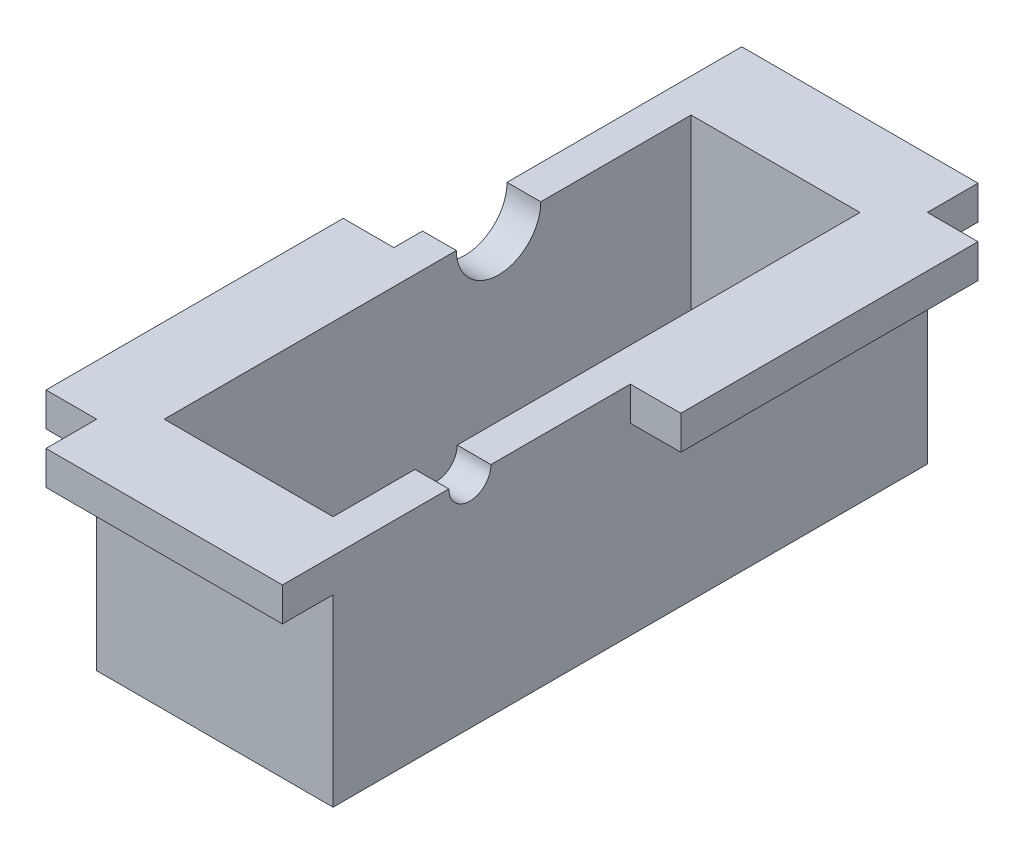
ISO-10303-21;
HEADER;
FILE_DESCRIPTION(('STEP AP214'),'2;1');
FILE_NAME('part.step','',(''),(''),'','','');
FILE_SCHEMA(('AUTOMOTIVE_DESIGN { 1 0 10303 214 1 1 1 1 }'));
ENDSEC;
DATA;
#1=APPLICATION_CONTEXT('core data for automotive mechanical design processes');
#2=APPLICATION_PROTOCOL_DEFINITION('international standard','automotive_design',2000,#1);
#3=PRODUCT_CONTEXT('',#1,'mechanical');
#4=PRODUCT('Part','Part','',(#3));
#5=PRODUCT_RELATED_PRODUCT_CATEGORY('part','',(#4));
#6=PRODUCT_DEFINITION_FORMATION('','',#4);
#7=PRODUCT_DEFINITION_CONTEXT('part definition',#1,'design');
#8=PRODUCT_DEFINITION('design','',#6,#7);
#9=PRODUCT_DEFINITION_SHAPE('','',#8);
#10=(LENGTH_UNIT() NAMED_UNIT(*) SI_UNIT(.MILLI.,.METRE.));
#11=(NAMED_UNIT(*) PLANE_ANGLE_UNIT() SI_UNIT($,.RADIAN.));
#12=(NAMED_UNIT(*) SI_UNIT($,.STERADIAN.) SOLID_ANGLE_UNIT());
#13=UNCERTAINTY_MEASURE_WITH_UNIT(LENGTH_MEASURE(1.E-05),#10,'distance_accuracy_value','');
#14=(GEOMETRIC_REPRESENTATION_CONTEXT(3) GLOBAL_UNCERTAINTY_ASSIGNED_CONTEXT((#13)) GLOBAL_UNIT_ASSIGNED_CONTEXT((#10,
#11,#12)) REPRESENTATION_CONTEXT('',''));
#15=CARTESIAN_POINT('',(0.,0.,0.));
#16=DIRECTION('',(0.,0.,1.));
#17=DIRECTION('',(1.,0.,0.));
#18=AXIS2_PLACEMENT_3D('',#15,#16,#17);
#19=CARTESIAN_POINT('',(-8.89,16.383,22.352));
#20=DIRECTION('',(0.,0.,-1.));
#21=DIRECTION('',(-1.,0.,0.));
#22=AXIS2_PLACEMENT_3D('',#19,#20,#21);
#23=PLANE('',#22);
#24=DIRECTION('',(0.,-1.,0.));
#25=VECTOR('',#24,1.);
#26=CARTESIAN_POINT('',(8.89,16.383,22.352));
#27=LINE('',#26,#25);
#28=CARTESIAN_POINT('',(8.89,13.843,22.352));
#29=VERTEX_POINT('',#28);
#30=CARTESIAN_POINT('',(8.89,0.,22.352));
#31=VERTEX_POINT('',#30);
#32=EDGE_CURVE('E358',#29,#31,#27,.T.);
#33=ORIENTED_EDGE('',*,*,#32,.F.);
#34=DIRECTION('',(-1.,0.,0.));
#35=VECTOR('',#34,1.);
#36=CARTESIAN_POINT('',(8.89,13.843,22.352));
#37=LINE('',#36,#35);
#38=CARTESIAN_POINT('',(-8.89,13.843,22.352));
#39=VERTEX_POINT('',#38);
#40=EDGE_CURVE('E230',#29,#39,#37,.T.);
#41=ORIENTED_EDGE('',*,*,#40,.T.);
#42=DIRECTION('',(0.,-1.,0.));
#43=VECTOR('',#42,1.);
#44=CARTESIAN_POINT('',(-8.89,16.383,22.352));
#45=LINE('',#44,#43);
#46=CARTESIAN_POINT('',(-8.89,0.,22.352));
#47=VERTEX_POINT('',#46);
#48=EDGE_CURVE('E375',#39,#47,#45,.T.);
#49=ORIENTED_EDGE('',*,*,#48,.T.);
#50=DIRECTION('',(1.,0.,0.));
#51=VECTOR('',#50,1.);
#52=CARTESIAN_POINT('',(-8.89,0.,22.352));
#53=LINE('',#52,#51);
#54=EDGE_CURVE('E366',#47,#31,#53,.T.);
#55=ORIENTED_EDGE('',*,*,#54,.T.);
#56=EDGE_LOOP('',(#33,#41,#49,#55));
#57=FACE_BOUND('',#56,.T.);
#58=ADVANCED_FACE('F39',(#57),#23,.F.);
#59=CARTESIAN_POINT('',(0.,16.383,0.));
#60=DIRECTION('',(0.,1.,0.));
#61=DIRECTION('',(0.,0.,1.));
#62=AXIS2_PLACEMENT_3D('',#59,#60,#61);
#63=PLANE('',#62);
#64=DIRECTION('',(1.,0.,0.));
#65=VECTOR('',#64,1.);
#66=CARTESIAN_POINT('',(4.572,16.383,13.6525));
#67=LINE('',#66,#65);
#68=CARTESIAN_POINT('',(6.35,16.383,13.6525));
#69=VERTEX_POINT('',#68);
#70=CARTESIAN_POINT('',(8.89,16.383,13.6525));
#71=VERTEX_POINT('',#70);
#72=EDGE_CURVE('E303',#69,#71,#67,.T.);
#73=ORIENTED_EDGE('',*,*,#72,.F.);
#74=DIRECTION('',(0.,0.,-1.));
#75=VECTOR('',#74,1.);
#76=CARTESIAN_POINT('',(6.35,16.383,-19.812));
#77=LINE('',#76,#75);
#78=CARTESIAN_POINT('',(6.35,16.383,19.812));
#79=VERTEX_POINT('',#78);
#80=EDGE_CURVE('E330',#79,#69,#77,.T.);
#81=ORIENTED_EDGE('',*,*,#80,.F.);
#82=DIRECTION('',(1.,0.,0.));
#83=VECTOR('',#82,1.);
#84=CARTESIAN_POINT('',(-6.35,16.383,19.812));
#85=LINE('',#84,#83);
#86=CARTESIAN_POINT('',(-6.35,16.383,19.812));
#87=VERTEX_POINT('',#86);
#88=EDGE_CURVE('E337',#87,#79,#85,.T.);
#89=ORIENTED_EDGE('',*,*,#88,.F.);
#90=DIRECTION('',(0.,0.,1.));
#91=VECTOR('',#90,1.);
#92=CARTESIAN_POINT('',(-6.35,16.383,-19.812));
#93=LINE('',#92,#91);
#94=CARTESIAN_POINT('',(-6.35,16.383,-2.15900000000001));
#95=VERTEX_POINT('',#94);
#96=EDGE_CURVE('E335',#95,#87,#93,.T.);
#97=ORIENTED_EDGE('',*,*,#96,.F.);
#98=DIRECTION('',(-1.,0.,0.));
#99=VECTOR('',#98,1.);
#100=CARTESIAN_POINT('',(-4.572,16.383,-2.15900000000001));
#101=LINE('',#100,#99);
#102=CARTESIAN_POINT('',(-8.89,16.383,-2.15900000000001));
#103=VERTEX_POINT('',#102);
#104=EDGE_CURVE('E308',#103,#95,#101,.F.);
#105=ORIENTED_EDGE('',*,*,#104,.F.);
#106=DIRECTION('',(0.,0.,1.));
#107=VECTOR('',#106,1.);
#108=CARTESIAN_POINT('',(-8.89,16.383,-22.352));
#109=LINE('',#108,#107);
#110=CARTESIAN_POINT('',(-8.89,16.383,0.));
#111=VERTEX_POINT('',#110);
#112=EDGE_CURVE('E353',#103,#111,#109,.T.);
#113=ORIENTED_EDGE('',*,*,#112,.T.);
#114=DIRECTION('',(-1.,0.,0.));
#115=VECTOR('',#114,1.);
#116=CARTESIAN_POINT('',(-8.89,16.383,0.));
#117=LINE('',#116,#115);
#118=CARTESIAN_POINT('',(-12.7,16.383,0.));
#119=VERTEX_POINT('',#118);
#120=EDGE_CURVE('E65',#111,#119,#117,.T.);
#121=ORIENTED_EDGE('',*,*,#120,.T.);
#122=DIRECTION('',(0.,0.,-1.));
#123=VECTOR('',#122,1.);
#124=CARTESIAN_POINT('',(-12.7,16.383,22.352));
#125=LINE('',#124,#123);
#126=CARTESIAN_POINT('',(-12.7,16.383,22.352));
#127=VERTEX_POINT('',#126);
#128=EDGE_CURVE('E243',#127,#119,#125,.T.);
#129=ORIENTED_EDGE('',*,*,#128,.F.);
#130=DIRECTION('',(1.,0.,0.));
#131=VECTOR('',#130,1.);
#132=CARTESIAN_POINT('',(-8.89,16.383,22.352));
#133=LINE('',#132,#131);
#134=CARTESIAN_POINT('',(-8.89,16.383,22.352));
#135=VERTEX_POINT('',#134);
#136=EDGE_CURVE('E360',#127,#135,#133,.T.);
#137=ORIENTED_EDGE('',*,*,#136,.T.);
#138=DIRECTION('',(0.,0.,1.));
#139=VECTOR('',#138,1.);
#140=CARTESIAN_POINT('',(-8.89,16.383,22.352));
#141=LINE('',#140,#139);
#142=CARTESIAN_POINT('',(-8.89,16.383,26.162));
#143=VERTEX_POINT('',#142);
#144=EDGE_CURVE('E53',#135,#143,#141,.T.);
#145=ORIENTED_EDGE('',*,*,#144,.T.);
#146=DIRECTION('',(-1.,0.,0.));
#147=VECTOR('',#146,1.);
#148=CARTESIAN_POINT('',(8.89,16.383,26.162));
#149=LINE('',#148,#147);
#150=CARTESIAN_POINT('',(8.89,16.383,26.162));
#151=VERTEX_POINT('',#150);
#152=EDGE_CURVE('E216',#151,#143,#149,.T.);
#153=ORIENTED_EDGE('',*,*,#152,.F.);
#154=DIRECTION('',(0.,0.,-1.));
#155=VECTOR('',#154,1.);
#156=CARTESIAN_POINT('',(8.89,16.383,-22.352));
#157=LINE('',#156,#155);
#158=EDGE_CURVE('E200',#151,#71,#157,.T.);
#159=ORIENTED_EDGE('',*,*,#158,.T.);
#160=EDGE_LOOP('',(#73,#81,#89,#97,#105,#113,#121,#129,#137,#145,#153,#159));
#161=FACE_BOUND('',#160,.T.);
#162=ADVANCED_FACE('F219',(#161),#63,.T.);
#163=CARTESIAN_POINT('',(8.89,16.383,-22.352));
#164=DIRECTION('',(-1.,0.,0.));
#165=DIRECTION('',(0.,0.,1.));
#166=AXIS2_PLACEMENT_3D('',#163,#164,#165);
#167=PLANE('',#166);
#168=DIRECTION('',(0.,0.,1.));
#169=VECTOR('',#168,1.);
#170=CARTESIAN_POINT('',(8.89,13.843,-22.352));
#171=LINE('',#170,#169);
#172=CARTESIAN_POINT('',(8.89,13.843,-22.352));
#173=VERTEX_POINT('',#172);
#174=CARTESIAN_POINT('',(8.89,13.843,0.));
#175=VERTEX_POINT('',#174);
#176=EDGE_CURVE('E50',#173,#175,#171,.T.);
#177=ORIENTED_EDGE('',*,*,#176,.T.);
#178=DIRECTION('',(0.,1.,0.));
#179=VECTOR('',#178,1.);
#180=CARTESIAN_POINT('',(8.89,16.383,0.));
#181=LINE('',#180,#179);
#182=CARTESIAN_POINT('',(8.89,16.383,0.));
#183=VERTEX_POINT('',#182);
#184=EDGE_CURVE('E11',#175,#183,#181,.T.);
#185=ORIENTED_EDGE('',*,*,#184,.T.);
#186=CARTESIAN_POINT('',(8.89,16.383,10.4775));
#187=VERTEX_POINT('',#186);
#188=EDGE_CURVE('E209',#187,#183,#157,.T.);
#189=ORIENTED_EDGE('',*,*,#188,.F.);
#190=CARTESIAN_POINT('',(8.89,16.383,12.065));
#191=DIRECTION('',(1.,0.,0.));
#192=DIRECTION('',(0.,0.,-1.));
#193=AXIS2_PLACEMENT_3D('',#190,#191,#192);
#194=CIRCLE('',#193,1.5875);
#195=EDGE_CURVE('E202',#71,#187,#194,.T.);
#196=ORIENTED_EDGE('',*,*,#195,.F.);
#197=ORIENTED_EDGE('',*,*,#158,.F.);
#198=DIRECTION('',(0.,1.,0.));
#199=VECTOR('',#198,1.);
#200=CARTESIAN_POINT('',(8.89,13.843,26.162));
#201=LINE('',#200,#199);
#202=CARTESIAN_POINT('',(8.89,13.843,26.162));
#203=VERTEX_POINT('',#202);
#204=EDGE_CURVE('E205',#203,#151,#201,.T.);
#205=ORIENTED_EDGE('',*,*,#204,.F.);
#206=DIRECTION('',(0.,0.,1.));
#207=VECTOR('',#206,1.);
#208=CARTESIAN_POINT('',(8.89,13.843,22.352));
#209=LINE('',#208,#207);
#210=EDGE_CURVE('E223',#29,#203,#209,.T.);
#211=ORIENTED_EDGE('',*,*,#210,.F.);
#212=ORIENTED_EDGE('',*,*,#32,.T.);
#213=DIRECTION('',(0.,0.,-1.));
#214=VECTOR('',#213,1.);
#215=CARTESIAN_POINT('',(8.89,0.,-22.352));
#216=LINE('',#215,#214);
#217=CARTESIAN_POINT('',(8.89,0.,-22.352));
#218=VERTEX_POINT('',#217);
#219=EDGE_CURVE('E349',#31,#218,#216,.T.);
#220=ORIENTED_EDGE('',*,*,#219,.T.);
#221=DIRECTION('',(0.,-1.,0.));
#222=VECTOR('',#221,1.);
#223=CARTESIAN_POINT('',(8.89,16.383,-22.352));
#224=LINE('',#223,#222);
#225=EDGE_CURVE('E306',#173,#218,#224,.T.);
#226=ORIENTED_EDGE('',*,*,#225,.F.);
#227=EDGE_LOOP('',(#177,#185,#189,#196,#197,#205,#211,#212,#220,#226));
#228=FACE_BOUND('',#227,.T.);
#229=ADVANCED_FACE('F41',(#228),#167,.F.);
#230=CARTESIAN_POINT('',(-8.89,16.383,-22.352));
#231=DIRECTION('',(1.,0.,0.));
#232=DIRECTION('',(0.,0.,-1.));
#233=AXIS2_PLACEMENT_3D('',#230,#231,#232);
#234=PLANE('',#233);
#235=ORIENTED_EDGE('',*,*,#48,.F.);
#236=DIRECTION('',(0.,0.,-1.));
#237=VECTOR('',#236,1.);
#238=CARTESIAN_POINT('',(-8.89,13.843,22.352));
#239=LINE('',#238,#237);
#240=CARTESIAN_POINT('',(-8.89,13.843,0.));
#241=VERTEX_POINT('',#240);
#242=EDGE_CURVE('E240',#39,#241,#239,.T.);
#243=ORIENTED_EDGE('',*,*,#242,.T.);
#244=DIRECTION('',(0.,1.,0.));
#245=VECTOR('',#244,1.);
#246=CARTESIAN_POINT('',(-8.89,13.843,0.));
#247=LINE('',#246,#245);
#248=EDGE_CURVE('E242',#241,#111,#247,.T.);
#249=ORIENTED_EDGE('',*,*,#248,.T.);
#250=ORIENTED_EDGE('',*,*,#112,.F.);
#251=CARTESIAN_POINT('',(-8.89,16.383,-5.33400000000001));
#252=DIRECTION('',(-1.,0.,0.));
#253=DIRECTION('',(0.,0.,1.));
#254=AXIS2_PLACEMENT_3D('',#251,#252,#253);
#255=CIRCLE('',#254,3.175);
#256=CARTESIAN_POINT('',(-8.89,16.383,-8.50900000000001));
#257=VERTEX_POINT('',#256);
#258=EDGE_CURVE('E296',#257,#103,#255,.T.);
#259=ORIENTED_EDGE('',*,*,#258,.F.);
#260=CARTESIAN_POINT('',(-8.89,16.383,-26.162));
#261=VERTEX_POINT('',#260);
#262=EDGE_CURVE('E354',#261,#257,#109,.T.);
#263=ORIENTED_EDGE('',*,*,#262,.F.);
#264=DIRECTION('',(0.,1.,0.));
#265=VECTOR('',#264,1.);
#266=CARTESIAN_POINT('',(-8.89,13.843,-26.162));
#267=LINE('',#266,#265);
#268=CARTESIAN_POINT('',(-8.89,13.843,-26.162));
#269=VERTEX_POINT('',#268);
#270=EDGE_CURVE('E268',#269,#261,#267,.T.);
#271=ORIENTED_EDGE('',*,*,#270,.F.);
#272=DIRECTION('',(0.,0.,-1.));
#273=VECTOR('',#272,1.);
#274=CARTESIAN_POINT('',(-8.89,13.843,-22.352));
#275=LINE('',#274,#273);
#276=CARTESIAN_POINT('',(-8.89,13.843,-22.352));
#277=VERTEX_POINT('',#276);
#278=EDGE_CURVE('E263',#277,#269,#275,.T.);
#279=ORIENTED_EDGE('',*,*,#278,.F.);
#280=DIRECTION('',(0.,-1.,0.));
#281=VECTOR('',#280,1.);
#282=CARTESIAN_POINT('',(-8.89,16.383,-22.352));
#283=LINE('',#282,#281);
#284=CARTESIAN_POINT('',(-8.89,0.,-22.352));
#285=VERTEX_POINT('',#284);
#286=EDGE_CURVE('E372',#277,#285,#283,.T.);
#287=ORIENTED_EDGE('',*,*,#286,.T.);
#288=DIRECTION('',(0.,0.,1.));
#289=VECTOR('',#288,1.);
#290=CARTESIAN_POINT('',(-8.89,0.,-22.352));
#291=LINE('',#290,#289);
#292=EDGE_CURVE('E364',#285,#47,#291,.T.);
#293=ORIENTED_EDGE('',*,*,#292,.T.);
#294=EDGE_LOOP('',(#235,#243,#249,#250,#259,#263,#271,#279,#287,#293));
#295=FACE_BOUND('',#294,.T.);
#296=ADVANCED_FACE('F426',(#295),#234,.F.);
#297=CARTESIAN_POINT('',(6.35,16.383,-19.812));
#298=DIRECTION('',(-1.,0.,0.));
#299=DIRECTION('',(0.,0.,1.));
#300=AXIS2_PLACEMENT_3D('',#297,#298,#299);
#301=PLANE('',#300);
#302=CARTESIAN_POINT('',(6.35,16.383,12.065));
#303=DIRECTION('',(-1.,0.,0.));
#304=DIRECTION('',(0.,0.,1.));
#305=AXIS2_PLACEMENT_3D('',#302,#303,#304);
#306=CIRCLE('',#305,1.5875);
#307=CARTESIAN_POINT('',(6.35,16.383,10.4775));
#308=VERTEX_POINT('',#307);
#309=EDGE_CURVE('E305',#308,#69,#306,.T.);
#310=ORIENTED_EDGE('',*,*,#309,.F.);
#311=CARTESIAN_POINT('',(6.35,16.383,-19.812));
#312=VERTEX_POINT('',#311);
#313=EDGE_CURVE('E326',#308,#312,#77,.T.);
#314=ORIENTED_EDGE('',*,*,#313,.T.);
#315=DIRECTION('',(0.,-1.,0.));
#316=VECTOR('',#315,1.);
#317=CARTESIAN_POINT('',(6.35,16.383,-19.812));
#318=LINE('',#317,#316);
#319=CARTESIAN_POINT('',(6.35,1.27,-19.812));
#320=VERTEX_POINT('',#319);
#321=EDGE_CURVE('E350',#312,#320,#318,.T.);
#322=ORIENTED_EDGE('',*,*,#321,.T.);
#323=DIRECTION('',(0.,0.,1.));
#324=VECTOR('',#323,1.);
#325=CARTESIAN_POINT('',(6.35,1.27,-19.812));
#326=LINE('',#325,#324);
#327=CARTESIAN_POINT('',(6.35,1.27,19.812));
#328=VERTEX_POINT('',#327);
#329=EDGE_CURVE('E314',#320,#328,#326,.T.);
#330=ORIENTED_EDGE('',*,*,#329,.T.);
#331=DIRECTION('',(0.,-1.,0.));
#332=VECTOR('',#331,1.);
#333=CARTESIAN_POINT('',(6.35,16.383,19.812));
#334=LINE('',#333,#332);
#335=EDGE_CURVE('E338',#79,#328,#334,.T.);
#336=ORIENTED_EDGE('',*,*,#335,.F.);
#337=ORIENTED_EDGE('',*,*,#80,.T.);
#338=EDGE_LOOP('',(#310,#314,#322,#330,#336,#337));
#339=FACE_BOUND('',#338,.T.);
#340=ADVANCED_FACE('F401',(#339),#301,.T.);
#341=CARTESIAN_POINT('',(-6.35,16.383,-19.812));
#342=DIRECTION('',(0.,0.,1.));
#343=DIRECTION('',(1.,0.,0.));
#344=AXIS2_PLACEMENT_3D('',#341,#342,#343);
#345=PLANE('',#344);
#346=DIRECTION('',(0.,-1.,0.));
#347=VECTOR('',#346,1.);
#348=CARTESIAN_POINT('',(-6.35,16.383,-19.812));
#349=LINE('',#348,#347);
#350=CARTESIAN_POINT('',(-6.35,16.383,-19.812));
#351=VERTEX_POINT('',#350);
#352=CARTESIAN_POINT('',(-6.35,1.27,-19.812));
#353=VERTEX_POINT('',#352);
#354=EDGE_CURVE('E343',#351,#353,#349,.T.);
#355=ORIENTED_EDGE('',*,*,#354,.T.);
#356=DIRECTION('',(1.,0.,0.));
#357=VECTOR('',#356,1.);
#358=CARTESIAN_POINT('',(-6.35,1.27,-19.812));
#359=LINE('',#358,#357);
#360=EDGE_CURVE('E323',#353,#320,#359,.T.);
#361=ORIENTED_EDGE('',*,*,#360,.T.);
#362=ORIENTED_EDGE('',*,*,#321,.F.);
#363=DIRECTION('',(-1.,0.,0.));
#364=VECTOR('',#363,1.);
#365=CARTESIAN_POINT('',(-6.35,16.383,-19.812));
#366=LINE('',#365,#364);
#367=EDGE_CURVE('E329',#312,#351,#366,.T.);
#368=ORIENTED_EDGE('',*,*,#367,.T.);
#369=EDGE_LOOP('',(#355,#361,#362,#368));
#370=FACE_BOUND('',#369,.T.);
#371=ADVANCED_FACE('F496',(#370),#345,.T.);
#372=CARTESIAN_POINT('',(-6.35,16.383,-19.812));
#373=DIRECTION('',(1.,0.,0.));
#374=DIRECTION('',(0.,0.,-1.));
#375=AXIS2_PLACEMENT_3D('',#372,#373,#374);
#376=PLANE('',#375);
#377=CARTESIAN_POINT('',(-6.35,16.383,-5.33400000000001));
#378=DIRECTION('',(1.,0.,0.));
#379=DIRECTION('',(0.,0.,-1.));
#380=AXIS2_PLACEMENT_3D('',#377,#378,#379);
#381=CIRCLE('',#380,3.175);
#382=CARTESIAN_POINT('',(-6.35,16.383,-8.50900000000001));
#383=VERTEX_POINT('',#382);
#384=EDGE_CURVE('E309',#95,#383,#381,.T.);
#385=ORIENTED_EDGE('',*,*,#384,.F.);
#386=ORIENTED_EDGE('',*,*,#96,.T.);
#387=DIRECTION('',(0.,-1.,0.));
#388=VECTOR('',#387,1.);
#389=CARTESIAN_POINT('',(-6.35,16.383,19.812));
#390=LINE('',#389,#388);
#391=CARTESIAN_POINT('',(-6.35,1.27,19.812));
#392=VERTEX_POINT('',#391);
#393=EDGE_CURVE('E341',#87,#392,#390,.T.);
#394=ORIENTED_EDGE('',*,*,#393,.T.);
#395=DIRECTION('',(0.,0.,-1.));
#396=VECTOR('',#395,1.);
#397=CARTESIAN_POINT('',(-6.35,1.27,-19.812));
#398=LINE('',#397,#396);
#399=EDGE_CURVE('E319',#392,#353,#398,.T.);
#400=ORIENTED_EDGE('',*,*,#399,.T.);
#401=ORIENTED_EDGE('',*,*,#354,.F.);
#402=EDGE_CURVE('E334',#351,#383,#93,.T.);
#403=ORIENTED_EDGE('',*,*,#402,.T.);
#404=EDGE_LOOP('',(#385,#386,#394,#400,#401,#403));
#405=FACE_BOUND('',#404,.T.);
#406=ADVANCED_FACE('F414',(#405),#376,.T.);
#407=CARTESIAN_POINT('',(-6.35,16.383,19.812));
#408=DIRECTION('',(0.,0.,-1.));
#409=DIRECTION('',(-1.,0.,0.));
#410=AXIS2_PLACEMENT_3D('',#407,#408,#409);
#411=PLANE('',#410);
#412=ORIENTED_EDGE('',*,*,#335,.T.);
#413=DIRECTION('',(-1.,0.,0.));
#414=VECTOR('',#413,1.);
#415=CARTESIAN_POINT('',(-6.35,1.27,19.812));
#416=LINE('',#415,#414);
#417=EDGE_CURVE('E320',#328,#392,#416,.T.);
#418=ORIENTED_EDGE('',*,*,#417,.T.);
#419=ORIENTED_EDGE('',*,*,#393,.F.);
#420=ORIENTED_EDGE('',*,*,#88,.T.);
#421=EDGE_LOOP('',(#412,#418,#419,#420));
#422=FACE_BOUND('',#421,.T.);
#423=ADVANCED_FACE('F415',(#422),#411,.T.);
#424=ORIENTED_EDGE('',*,*,#188,.T.);
#425=DIRECTION('',(1.,0.,0.));
#426=VECTOR('',#425,1.);
#427=CARTESIAN_POINT('',(8.87743678880745,16.383,0.));
#428=LINE('',#427,#426);
#429=CARTESIAN_POINT('',(12.6874367888074,16.383,0.));
#430=VERTEX_POINT('',#429);
#431=EDGE_CURVE('E280',#183,#430,#428,.T.);
#432=ORIENTED_EDGE('',*,*,#431,.T.);
#433=DIRECTION('',(0.,0.,1.));
#434=VECTOR('',#433,1.);
#435=CARTESIAN_POINT('',(12.6874367888074,16.383,-22.352));
#436=LINE('',#435,#434);
#437=CARTESIAN_POINT('',(12.6874367888074,16.383,-22.352));
#438=VERTEX_POINT('',#437);
#439=EDGE_CURVE('E284',#438,#430,#436,.T.);
#440=ORIENTED_EDGE('',*,*,#439,.F.);
#441=DIRECTION('',(-1.,0.,0.));
#442=VECTOR('',#441,1.);
#443=CARTESIAN_POINT('',(-8.89,16.383,-22.352));
#444=LINE('',#443,#442);
#445=CARTESIAN_POINT('',(8.87743678880744,16.383,-22.352));
#446=VERTEX_POINT('',#445);
#447=EDGE_CURVE('E207',#438,#446,#444,.T.);
#448=ORIENTED_EDGE('',*,*,#447,.T.);
#449=DIRECTION('',(0.,0.,-1.));
#450=VECTOR('',#449,1.);
#451=CARTESIAN_POINT('',(8.87743678880745,16.383,-22.352));
#452=LINE('',#451,#450);
#453=CARTESIAN_POINT('',(8.87743678880745,16.383,-26.162));
#454=VERTEX_POINT('',#453);
#455=EDGE_CURVE('E275',#446,#454,#452,.T.);
#456=ORIENTED_EDGE('',*,*,#455,.T.);
#457=DIRECTION('',(1.,0.,0.));
#458=VECTOR('',#457,1.);
#459=CARTESIAN_POINT('',(-8.89,16.383,-26.162));
#460=LINE('',#459,#458);
#461=EDGE_CURVE('E247',#261,#454,#460,.T.);
#462=ORIENTED_EDGE('',*,*,#461,.F.);
#463=ORIENTED_EDGE('',*,*,#262,.T.);
#464=DIRECTION('',(-1.,0.,0.));
#465=VECTOR('',#464,1.);
#466=CARTESIAN_POINT('',(-4.572,16.383,-8.50900000000001));
#467=LINE('',#466,#465);
#468=EDGE_CURVE('E315',#383,#257,#467,.T.);
#469=ORIENTED_EDGE('',*,*,#468,.F.);
#470=ORIENTED_EDGE('',*,*,#402,.F.);
#471=ORIENTED_EDGE('',*,*,#367,.F.);
#472=ORIENTED_EDGE('',*,*,#313,.F.);
#473=DIRECTION('',(1.,0.,0.));
#474=VECTOR('',#473,1.);
#475=CARTESIAN_POINT('',(4.572,16.383,10.4775));
#476=LINE('',#475,#474);
#477=EDGE_CURVE('E297',#187,#308,#476,.F.);
#478=ORIENTED_EDGE('',*,*,#477,.F.);
#479=EDGE_LOOP('',(#424,#432,#440,#448,#456,#462,#463,#469,#470,#471,#472,#478));
#480=FACE_BOUND('',#479,.T.);
#481=ADVANCED_FACE('F391',(#480),#63,.T.);
#482=CARTESIAN_POINT('',(0.,0.,0.));
#483=DIRECTION('',(0.,1.,0.));
#484=DIRECTION('',(0.,0.,1.));
#485=AXIS2_PLACEMENT_3D('',#482,#483,#484);
#486=PLANE('',#485);
#487=ORIENTED_EDGE('',*,*,#219,.F.);
#488=ORIENTED_EDGE('',*,*,#54,.F.);
#489=ORIENTED_EDGE('',*,*,#292,.F.);
#490=DIRECTION('',(-1.,0.,0.));
#491=VECTOR('',#490,1.);
#492=CARTESIAN_POINT('',(-8.89,0.,-22.352));
#493=LINE('',#492,#491);
#494=EDGE_CURVE('E362',#218,#285,#493,.T.);
#495=ORIENTED_EDGE('',*,*,#494,.F.);
#496=EDGE_LOOP('',(#487,#488,#489,#495));
#497=FACE_BOUND('',#496,.T.);
#498=ADVANCED_FACE('F439',(#497),#486,.F.);
#499=CARTESIAN_POINT('',(-8.89,16.383,-22.352));
#500=DIRECTION('',(0.,0.,1.));
#501=DIRECTION('',(1.,0.,0.));
#502=AXIS2_PLACEMENT_3D('',#499,#500,#501);
#503=PLANE('',#502);
#504=ORIENTED_EDGE('',*,*,#286,.F.);
#505=DIRECTION('',(1.,0.,0.));
#506=VECTOR('',#505,1.);
#507=CARTESIAN_POINT('',(-8.89,13.843,-22.352));
#508=LINE('',#507,#506);
#509=CARTESIAN_POINT('',(8.87743678880745,13.843,-22.352));
#510=VERTEX_POINT('',#509);
#511=EDGE_CURVE('E261',#277,#510,#508,.T.);
#512=ORIENTED_EDGE('',*,*,#511,.T.);
#513=DIRECTION('',(0.,1.,0.));
#514=VECTOR('',#513,1.);
#515=CARTESIAN_POINT('',(8.87743678880745,13.843,-22.352));
#516=LINE('',#515,#514);
#517=EDGE_CURVE('E260',#510,#446,#516,.T.);
#518=ORIENTED_EDGE('',*,*,#517,.T.);
#519=ORIENTED_EDGE('',*,*,#447,.F.);
#520=DIRECTION('',(0.,1.,0.));
#521=VECTOR('',#520,1.);
#522=CARTESIAN_POINT('',(12.6874367888074,13.843,-22.352));
#523=LINE('',#522,#521);
#524=CARTESIAN_POINT('',(12.6874367888074,13.843,-22.352));
#525=VERTEX_POINT('',#524);
#526=EDGE_CURVE('E291',#525,#438,#523,.T.);
#527=ORIENTED_EDGE('',*,*,#526,.F.);
#528=DIRECTION('',(1.,0.,0.));
#529=VECTOR('',#528,1.);
#530=CARTESIAN_POINT('',(8.87743678880745,13.843,-22.352));
#531=LINE('',#530,#529);
#532=EDGE_CURVE('E290',#173,#525,#531,.T.);
#533=ORIENTED_EDGE('',*,*,#532,.F.);
#534=ORIENTED_EDGE('',*,*,#225,.T.);
#535=ORIENTED_EDGE('',*,*,#494,.T.);
#536=EDGE_LOOP('',(#504,#512,#518,#519,#527,#533,#534,#535));
#537=FACE_BOUND('',#536,.T.);
#538=ADVANCED_FACE('F384',(#537),#503,.F.);
#539=DIRECTION('',(-1.,0.,0.));
#540=VECTOR('',#539,1.);
#541=CARTESIAN_POINT('',(-8.89,13.843,22.352));
#542=LINE('',#541,#540);
#543=CARTESIAN_POINT('',(-12.7,13.843,22.352));
#544=VERTEX_POINT('',#543);
#545=EDGE_CURVE('E253',#39,#544,#542,.T.);
#546=ORIENTED_EDGE('',*,*,#545,.F.);
#547=DIRECTION('',(0.,1.,0.));
#548=VECTOR('',#547,1.);
#549=CARTESIAN_POINT('',(-8.89,13.843,22.352));
#550=LINE('',#549,#548);
#551=EDGE_CURVE('E226',#39,#135,#550,.T.);
#552=ORIENTED_EDGE('',*,*,#551,.T.);
#553=ORIENTED_EDGE('',*,*,#136,.F.);
#554=DIRECTION('',(0.,1.,0.));
#555=VECTOR('',#554,1.);
#556=CARTESIAN_POINT('',(-12.7,13.843,22.352));
#557=LINE('',#556,#555);
#558=EDGE_CURVE('E236',#544,#127,#557,.T.);
#559=ORIENTED_EDGE('',*,*,#558,.F.);
#560=EDGE_LOOP('',(#546,#552,#553,#559));
#561=FACE_BOUND('',#560,.T.);
#562=ADVANCED_FACE('F455',(#561),#23,.F.);
#563=CARTESIAN_POINT('',(0.,1.27,0.));
#564=DIRECTION('',(0.,1.,0.));
#565=DIRECTION('',(0.,0.,1.));
#566=AXIS2_PLACEMENT_3D('',#563,#564,#565);
#567=PLANE('',#566);
#568=ORIENTED_EDGE('',*,*,#329,.F.);
#569=ORIENTED_EDGE('',*,*,#360,.F.);
#570=ORIENTED_EDGE('',*,*,#399,.F.);
#571=ORIENTED_EDGE('',*,*,#417,.F.);
#572=EDGE_LOOP('',(#568,#569,#570,#571));
#573=FACE_BOUND('',#572,.T.);
#574=ADVANCED_FACE('F485',(#573),#567,.T.);
#575=CARTESIAN_POINT('',(-4.572,16.383,-5.33400000000001));
#576=DIRECTION('',(-1.,0.,0.));
#577=DIRECTION('',(0.,0.,1.));
#578=AXIS2_PLACEMENT_3D('',#575,#576,#577);
#579=CYLINDRICAL_SURFACE('',#578,3.175);
#580=ORIENTED_EDGE('',*,*,#468,.T.);
#581=ORIENTED_EDGE('',*,*,#258,.T.);
#582=ORIENTED_EDGE('',*,*,#104,.T.);
#583=ORIENTED_EDGE('',*,*,#384,.T.);
#584=EDGE_LOOP('',(#580,#581,#582,#583));
#585=FACE_BOUND('',#584,.T.);
#586=ADVANCED_FACE('F419',(#585),#579,.F.);
#587=CARTESIAN_POINT('',(4.572,16.383,12.065));
#588=DIRECTION('',(1.,0.,0.));
#589=DIRECTION('',(0.,0.,-1.));
#590=AXIS2_PLACEMENT_3D('',#587,#588,#589);
#591=CYLINDRICAL_SURFACE('',#590,1.5875);
#592=ORIENTED_EDGE('',*,*,#72,.T.);
#593=ORIENTED_EDGE('',*,*,#195,.T.);
#594=ORIENTED_EDGE('',*,*,#477,.T.);
#595=ORIENTED_EDGE('',*,*,#309,.T.);
#596=EDGE_LOOP('',(#592,#593,#594,#595));
#597=FACE_BOUND('',#596,.T.);
#598=ADVANCED_FACE('F402',(#597),#591,.F.);
#599=CARTESIAN_POINT('',(8.87743678880745,13.843,0.));
#600=DIRECTION('',(0.,0.,1.));
#601=DIRECTION('',(1.,0.,0.));
#602=AXIS2_PLACEMENT_3D('',#599,#600,#601);
#603=PLANE('',#602);
#604=ORIENTED_EDGE('',*,*,#184,.F.);
#605=DIRECTION('',(1.,0.,0.));
#606=VECTOR('',#605,1.);
#607=CARTESIAN_POINT('',(8.87743678880745,13.843,0.));
#608=LINE('',#607,#606);
#609=CARTESIAN_POINT('',(12.6874367888074,13.843,0.));
#610=VERTEX_POINT('',#609);
#611=EDGE_CURVE('E282',#175,#610,#608,.T.);
#612=ORIENTED_EDGE('',*,*,#611,.T.);
#613=DIRECTION('',(0.,1.,0.));
#614=VECTOR('',#613,1.);
#615=CARTESIAN_POINT('',(12.6874367888074,13.843,0.));
#616=LINE('',#615,#614);
#617=EDGE_CURVE('E288',#610,#430,#616,.T.);
#618=ORIENTED_EDGE('',*,*,#617,.T.);
#619=ORIENTED_EDGE('',*,*,#431,.F.);
#620=EDGE_LOOP('',(#604,#612,#618,#619));
#621=FACE_BOUND('',#620,.T.);
#622=ADVANCED_FACE('F393',(#621),#603,.T.);
#623=CARTESIAN_POINT('',(0.,13.843,0.));
#624=DIRECTION('',(0.,-1.,0.));
#625=DIRECTION('',(0.,0.,-1.));
#626=AXIS2_PLACEMENT_3D('',#623,#624,#625);
#627=PLANE('',#626);
#628=ORIENTED_EDGE('',*,*,#176,.F.);
#629=ORIENTED_EDGE('',*,*,#532,.T.);
#630=DIRECTION('',(0.,0.,1.));
#631=VECTOR('',#630,1.);
#632=CARTESIAN_POINT('',(12.6874367888074,13.843,-22.352));
#633=LINE('',#632,#631);
#634=EDGE_CURVE('E283',#525,#610,#633,.T.);
#635=ORIENTED_EDGE('',*,*,#634,.T.);
#636=ORIENTED_EDGE('',*,*,#611,.F.);
#637=EDGE_LOOP('',(#628,#629,#635,#636));
#638=FACE_BOUND('',#637,.T.);
#639=ADVANCED_FACE('F381',(#638),#627,.T.);
#640=CARTESIAN_POINT('',(12.6874367888074,13.843,-22.352));
#641=DIRECTION('',(-1.,0.,0.));
#642=DIRECTION('',(0.,0.,1.));
#643=AXIS2_PLACEMENT_3D('',#640,#641,#642);
#644=PLANE('',#643);
#645=ORIENTED_EDGE('',*,*,#439,.T.);
#646=ORIENTED_EDGE('',*,*,#617,.F.);
#647=ORIENTED_EDGE('',*,*,#634,.F.);
#648=ORIENTED_EDGE('',*,*,#526,.T.);
#649=EDGE_LOOP('',(#645,#646,#647,#648));
#650=FACE_BOUND('',#649,.T.);
#651=ADVANCED_FACE('F392',(#650),#644,.F.);
#652=CARTESIAN_POINT('',(-8.89,13.843,-26.162));
#653=DIRECTION('',(0.,0.,1.));
#654=DIRECTION('',(1.,0.,0.));
#655=AXIS2_PLACEMENT_3D('',#652,#653,#654);
#656=PLANE('',#655);
#657=ORIENTED_EDGE('',*,*,#461,.T.);
#658=DIRECTION('',(0.,1.,0.));
#659=VECTOR('',#658,1.);
#660=CARTESIAN_POINT('',(8.87743678880745,13.843,-26.162));
#661=LINE('',#660,#659);
#662=CARTESIAN_POINT('',(8.87743678880745,13.843,-26.162));
#663=VERTEX_POINT('',#662);
#664=EDGE_CURVE('E270',#663,#454,#661,.T.);
#665=ORIENTED_EDGE('',*,*,#664,.F.);
#666=DIRECTION('',(1.,0.,0.));
#667=VECTOR('',#666,1.);
#668=CARTESIAN_POINT('',(-8.89,13.843,-26.162));
#669=LINE('',#668,#667);
#670=EDGE_CURVE('E257',#269,#663,#669,.T.);
#671=ORIENTED_EDGE('',*,*,#670,.F.);
#672=ORIENTED_EDGE('',*,*,#270,.T.);
#673=EDGE_LOOP('',(#657,#665,#671,#672));
#674=FACE_BOUND('',#673,.T.);
#675=ADVANCED_FACE('F429',(#674),#656,.F.);
#676=CARTESIAN_POINT('',(8.87743678880745,13.843,-22.352));
#677=DIRECTION('',(1.,0.,0.));
#678=DIRECTION('',(0.,0.,-1.));
#679=AXIS2_PLACEMENT_3D('',#676,#677,#678);
#680=PLANE('',#679);
#681=ORIENTED_EDGE('',*,*,#455,.F.);
#682=ORIENTED_EDGE('',*,*,#517,.F.);
#683=DIRECTION('',(0.,0.,-1.));
#684=VECTOR('',#683,1.);
#685=CARTESIAN_POINT('',(8.87743678880745,13.843,-22.352));
#686=LINE('',#685,#684);
#687=EDGE_CURVE('E262',#510,#663,#686,.T.);
#688=ORIENTED_EDGE('',*,*,#687,.T.);
#689=ORIENTED_EDGE('',*,*,#664,.T.);
#690=EDGE_LOOP('',(#681,#682,#688,#689));
#691=FACE_BOUND('',#690,.T.);
#692=ADVANCED_FACE('F466',(#691),#680,.T.);
#693=CARTESIAN_POINT('',(0.,13.843,0.));
#694=DIRECTION('',(0.,1.,0.));
#695=DIRECTION('',(0.,0.,1.));
#696=AXIS2_PLACEMENT_3D('',#693,#694,#695);
#697=PLANE('',#696);
#698=ORIENTED_EDGE('',*,*,#670,.T.);
#699=ORIENTED_EDGE('',*,*,#687,.F.);
#700=ORIENTED_EDGE('',*,*,#511,.F.);
#701=ORIENTED_EDGE('',*,*,#278,.T.);
#702=EDGE_LOOP('',(#698,#699,#700,#701));
#703=FACE_BOUND('',#702,.T.);
#704=ADVANCED_FACE('F433',(#703),#697,.F.);
#705=CARTESIAN_POINT('',(-8.89,13.843,0.));
#706=DIRECTION('',(0.,0.,-1.));
#707=DIRECTION('',(-1.,0.,0.));
#708=AXIS2_PLACEMENT_3D('',#705,#706,#707);
#709=PLANE('',#708);
#710=ORIENTED_EDGE('',*,*,#120,.F.);
#711=ORIENTED_EDGE('',*,*,#248,.F.);
#712=DIRECTION('',(-1.,0.,0.));
#713=VECTOR('',#712,1.);
#714=CARTESIAN_POINT('',(-8.89,13.843,0.));
#715=LINE('',#714,#713);
#716=CARTESIAN_POINT('',(-12.7,13.843,0.));
#717=VERTEX_POINT('',#716);
#718=EDGE_CURVE('E246',#241,#717,#715,.T.);
#719=ORIENTED_EDGE('',*,*,#718,.T.);
#720=DIRECTION('',(0.,1.,0.));
#721=VECTOR('',#720,1.);
#722=CARTESIAN_POINT('',(-12.7,13.843,0.));
#723=LINE('',#722,#721);
#724=EDGE_CURVE('E234',#717,#119,#723,.T.);
#725=ORIENTED_EDGE('',*,*,#724,.T.);
#726=EDGE_LOOP('',(#710,#711,#719,#725));
#727=FACE_BOUND('',#726,.T.);
#728=ADVANCED_FACE('F456',(#727),#709,.T.);
#729=CARTESIAN_POINT('',(-12.7,13.843,22.352));
#730=DIRECTION('',(1.,0.,0.));
#731=DIRECTION('',(0.,0.,-1.));
#732=AXIS2_PLACEMENT_3D('',#729,#730,#731);
#733=PLANE('',#732);
#734=ORIENTED_EDGE('',*,*,#128,.T.);
#735=ORIENTED_EDGE('',*,*,#724,.F.);
#736=DIRECTION('',(0.,0.,-1.));
#737=VECTOR('',#736,1.);
#738=CARTESIAN_POINT('',(-12.7,13.843,22.352));
#739=LINE('',#738,#737);
#740=EDGE_CURVE('E251',#544,#717,#739,.T.);
#741=ORIENTED_EDGE('',*,*,#740,.F.);
#742=ORIENTED_EDGE('',*,*,#558,.T.);
#743=EDGE_LOOP('',(#734,#735,#741,#742));
#744=FACE_BOUND('',#743,.T.);
#745=ADVANCED_FACE('F460',(#744),#733,.F.);
#746=CARTESIAN_POINT('',(0.,13.843,0.));
#747=DIRECTION('',(0.,-1.,0.));
#748=DIRECTION('',(0.,0.,-1.));
#749=AXIS2_PLACEMENT_3D('',#746,#747,#748);
#750=PLANE('',#749);
#751=ORIENTED_EDGE('',*,*,#718,.F.);
#752=ORIENTED_EDGE('',*,*,#242,.F.);
#753=ORIENTED_EDGE('',*,*,#545,.T.);
#754=ORIENTED_EDGE('',*,*,#740,.T.);
#755=EDGE_LOOP('',(#751,#752,#753,#754));
#756=FACE_BOUND('',#755,.T.);
#757=ADVANCED_FACE('F449',(#756),#750,.T.);
#758=CARTESIAN_POINT('',(8.89,13.843,26.162));
#759=DIRECTION('',(0.,0.,-1.));
#760=DIRECTION('',(-1.,0.,0.));
#761=AXIS2_PLACEMENT_3D('',#758,#759,#760);
#762=PLANE('',#761);
#763=ORIENTED_EDGE('',*,*,#152,.T.);
#764=DIRECTION('',(0.,1.,0.));
#765=VECTOR('',#764,1.);
#766=CARTESIAN_POINT('',(-8.89,13.843,26.162));
#767=LINE('',#766,#765);
#768=CARTESIAN_POINT('',(-8.89,13.843,26.162));
#769=VERTEX_POINT('',#768);
#770=EDGE_CURVE('E231',#769,#143,#767,.T.);
#771=ORIENTED_EDGE('',*,*,#770,.F.);
#772=DIRECTION('',(-1.,0.,0.));
#773=VECTOR('',#772,1.);
#774=CARTESIAN_POINT('',(8.89,13.843,26.162));
#775=LINE('',#774,#773);
#776=EDGE_CURVE('E220',#203,#769,#775,.T.);
#777=ORIENTED_EDGE('',*,*,#776,.F.);
#778=ORIENTED_EDGE('',*,*,#204,.T.);
#779=EDGE_LOOP('',(#763,#771,#777,#778));
#780=FACE_BOUND('',#779,.T.);
#781=ADVANCED_FACE('F212',(#780),#762,.F.);
#782=CARTESIAN_POINT('',(-8.89,13.843,22.352));
#783=DIRECTION('',(-1.,0.,0.));
#784=DIRECTION('',(0.,0.,1.));
#785=AXIS2_PLACEMENT_3D('',#782,#783,#784);
#786=PLANE('',#785);
#787=ORIENTED_EDGE('',*,*,#144,.F.);
#788=ORIENTED_EDGE('',*,*,#551,.F.);
#789=DIRECTION('',(0.,0.,1.));
#790=VECTOR('',#789,1.);
#791=CARTESIAN_POINT('',(-8.89,13.843,22.352));
#792=LINE('',#791,#790);
#793=EDGE_CURVE('E217',#39,#769,#792,.T.);
#794=ORIENTED_EDGE('',*,*,#793,.T.);
#795=ORIENTED_EDGE('',*,*,#770,.T.);
#796=EDGE_LOOP('',(#787,#788,#794,#795));
#797=FACE_BOUND('',#796,.T.);
#798=ADVANCED_FACE('F469',(#797),#786,.T.);
#799=CARTESIAN_POINT('',(0.,13.843,0.));
#800=DIRECTION('',(0.,1.,0.));
#801=DIRECTION('',(0.,0.,1.));
#802=AXIS2_PLACEMENT_3D('',#799,#800,#801);
#803=PLANE('',#802);
#804=ORIENTED_EDGE('',*,*,#776,.T.);
#805=ORIENTED_EDGE('',*,*,#793,.F.);
#806=ORIENTED_EDGE('',*,*,#40,.F.);
#807=ORIENTED_EDGE('',*,*,#210,.T.);
#808=EDGE_LOOP('',(#804,#805,#806,#807));
#809=FACE_BOUND('',#808,.T.);
#810=ADVANCED_FACE('F647',(#809),#803,.F.);
#811=CLOSED_SHELL('',(#58,#162,#229,#296,#340,#371,#406,#423,#481,#498,#538,#562,#574,#586,#598,
#622,#639,#651,#675,#692,#704,#728,#745,#757,#781,#798,#810));
#812=MANIFOLD_SOLID_BREP('B2',#811);
#813=ADVANCED_BREP_SHAPE_REPRESENTATION('',(#18,#812),#14);
#814=SHAPE_DEFINITION_REPRESENTATION(#9,#813);
ENDSEC;
END-ISO-10303-21;
